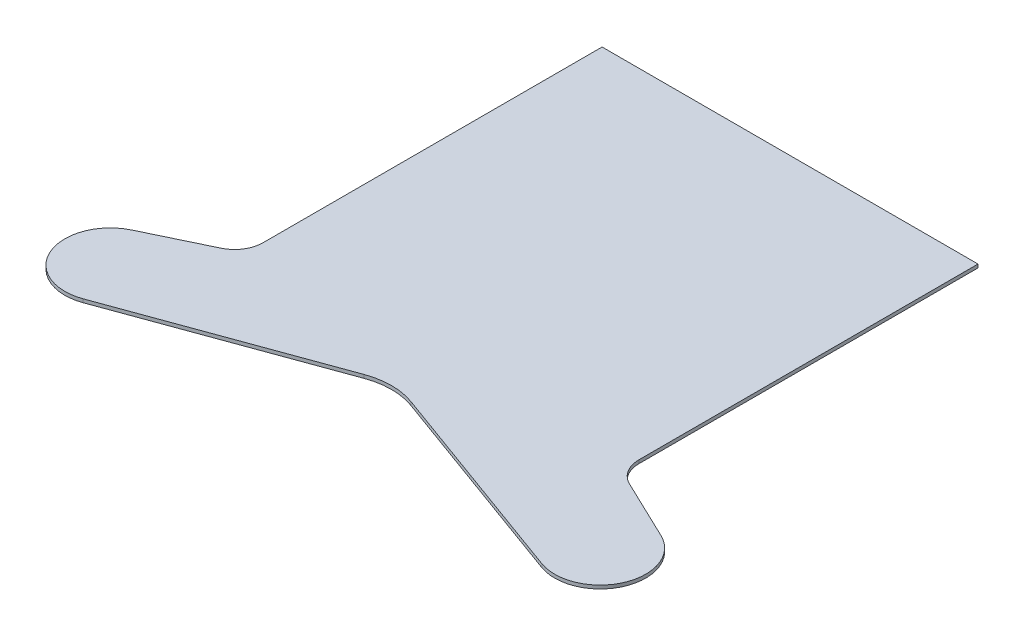
ISO-10303-21;
HEADER;
FILE_DESCRIPTION(('STEP AP214'),'2;1');
FILE_NAME('part.step','',(''),(''),'','','');
FILE_SCHEMA(('AUTOMOTIVE_DESIGN { 1 0 10303 214 1 1 1 1 }'));
ENDSEC;
DATA;
#1=APPLICATION_CONTEXT('core data for automotive mechanical design processes');
#2=APPLICATION_PROTOCOL_DEFINITION('international standard','automotive_design',2000,#1);
#3=PRODUCT_CONTEXT('',#1,'mechanical');
#4=PRODUCT('Part','Part','',(#3));
#5=PRODUCT_RELATED_PRODUCT_CATEGORY('part','',(#4));
#6=PRODUCT_DEFINITION_FORMATION('','',#4);
#7=PRODUCT_DEFINITION_CONTEXT('part definition',#1,'design');
#8=PRODUCT_DEFINITION('design','',#6,#7);
#9=PRODUCT_DEFINITION_SHAPE('','',#8);
#10=(LENGTH_UNIT() NAMED_UNIT(*) SI_UNIT(.MILLI.,.METRE.));
#11=(NAMED_UNIT(*) PLANE_ANGLE_UNIT() SI_UNIT($,.RADIAN.));
#12=(NAMED_UNIT(*) SI_UNIT($,.STERADIAN.) SOLID_ANGLE_UNIT());
#13=UNCERTAINTY_MEASURE_WITH_UNIT(LENGTH_MEASURE(1.E-05),#10,'distance_accuracy_value','');
#14=(GEOMETRIC_REPRESENTATION_CONTEXT(3) GLOBAL_UNCERTAINTY_ASSIGNED_CONTEXT((#13)) GLOBAL_UNIT_ASSIGNED_CONTEXT((#10,
#11,#12)) REPRESENTATION_CONTEXT('',''));
#15=CARTESIAN_POINT('',(0.,0.,0.));
#16=DIRECTION('',(0.,0.,1.));
#17=DIRECTION('',(1.,0.,0.));
#18=AXIS2_PLACEMENT_3D('',#15,#16,#17);
#19=CARTESIAN_POINT('',(24.4316355925699,3.,67.1253671109287));
#20=DIRECTION('',(-0.342020143325673,0.,-0.939692620785907));
#21=DIRECTION('',(-0.939692620785907,0.,0.342020143325673));
#22=AXIS2_PLACEMENT_3D('',#19,#20,#21);
#23=PLANE('',#22);
#24=DIRECTION('',(0.939692620785907,0.,-0.342020143325673));
#25=VECTOR('',#24,1.);
#26=CARTESIAN_POINT('',(24.4316355925699,0.,67.1253671109287));
#27=LINE('',#26,#25);
#28=CARTESIAN_POINT('',(-36.3191942669731,0.,89.2368608867731));
#29=VERTEX_POINT('',#28);
#30=CARTESIAN_POINT('',(144.47879140046,0.,23.4317756885392));
#31=VERTEX_POINT('',#30);
#32=EDGE_CURVE('E210',#29,#31,#27,.T.);
#33=ORIENTED_EDGE('',*,*,#32,.T.);
#34=DIRECTION('',(0.,-1.,0.));
#35=VECTOR('',#34,1.);
#36=CARTESIAN_POINT('',(144.47879140046,3.,23.4317756885392));
#37=LINE('',#36,#35);
#38=CARTESIAN_POINT('',(144.47879140046,3.,23.4317756885392));
#39=VERTEX_POINT('',#38);
#40=EDGE_CURVE('E91',#39,#31,#37,.T.);
#41=ORIENTED_EDGE('',*,*,#40,.F.);
#42=DIRECTION('',(0.939692620785907,0.,-0.342020143325673));
#43=VECTOR('',#42,1.);
#44=CARTESIAN_POINT('',(24.4316355925699,3.,67.1253671109287));
#45=LINE('',#44,#43);
#46=CARTESIAN_POINT('',(-36.3191942669731,3.,89.2368608867731));
#47=VERTEX_POINT('',#46);
#48=EDGE_CURVE('E149',#47,#39,#45,.T.);
#49=ORIENTED_EDGE('',*,*,#48,.F.);
#50=DIRECTION('',(0.,-1.,0.));
#51=VECTOR('',#50,1.);
#52=CARTESIAN_POINT('',(-36.3191942669731,3.,89.2368608867731));
#53=LINE('',#52,#51);
#54=EDGE_CURVE('E12',#47,#29,#53,.T.);
#55=ORIENTED_EDGE('',*,*,#54,.T.);
#56=EDGE_LOOP('',(#33,#41,#49,#55));
#57=FACE_BOUND('',#56,.T.);
#58=ADVANCED_FACE('F81',(#57),#23,.F.);
#59=CARTESIAN_POINT('',(165.,3.,79.8133329356935));
#60=DIRECTION('',(0.,-1.,0.));
#61=DIRECTION('',(0.,0.,-1.));
#62=AXIS2_PLACEMENT_3D('',#59,#60,#61);
#63=CYLINDRICAL_SURFACE('',#62,60.);
#64=CARTESIAN_POINT('',(165.,0.,79.8133329356935));
#65=DIRECTION('',(0.,1.,0.));
#66=DIRECTION('',(0.,0.,1.));
#67=AXIS2_PLACEMENT_3D('',#64,#65,#66);
#68=CIRCLE('',#67,60.);
#69=CARTESIAN_POINT('',(185.52120859954,0.,23.4317756885392));
#70=VERTEX_POINT('',#69);
#71=EDGE_CURVE('E214',#70,#31,#68,.T.);
#72=ORIENTED_EDGE('',*,*,#71,.F.);
#73=DIRECTION('',(0.,-1.,0.));
#74=VECTOR('',#73,1.);
#75=CARTESIAN_POINT('',(185.52120859954,3.,23.4317756885392));
#76=LINE('',#75,#74);
#77=CARTESIAN_POINT('',(185.52120859954,3.,23.4317756885392));
#78=VERTEX_POINT('',#77);
#79=EDGE_CURVE('E273',#78,#70,#76,.T.);
#80=ORIENTED_EDGE('',*,*,#79,.F.);
#81=CARTESIAN_POINT('',(165.,3.,79.8133329356935));
#82=DIRECTION('',(0.,1.,0.));
#83=DIRECTION('',(0.,0.,1.));
#84=AXIS2_PLACEMENT_3D('',#81,#82,#83);
#85=CIRCLE('',#84,60.);
#86=EDGE_CURVE('E281',#78,#39,#85,.T.);
#87=ORIENTED_EDGE('',*,*,#86,.T.);
#88=ORIENTED_EDGE('',*,*,#40,.T.);
#89=EDGE_LOOP('',(#72,#80,#87,#88));
#90=FACE_BOUND('',#89,.T.);
#91=ADVANCED_FACE('F279',(#90),#63,.F.);
#92=CARTESIAN_POINT('',(14.1710312927996,3.,-38.9345884873514));
#93=DIRECTION('',(0.342020143325673,0.,-0.939692620785907));
#94=DIRECTION('',(-0.939692620785907,0.,-0.342020143325673));
#95=AXIS2_PLACEMENT_3D('',#92,#93,#94);
#96=PLANE('',#95);
#97=DIRECTION('',(0.939692620785907,0.,0.342020143325673));
#98=VECTOR('',#97,1.);
#99=CARTESIAN_POINT('',(14.1710312927996,0.,-38.9345884873514));
#100=LINE('',#99,#98);
#101=CARTESIAN_POINT('',(366.319194266973,0.,89.2368608867731));
#102=VERTEX_POINT('',#101);
#103=EDGE_CURVE('E218',#70,#102,#100,.T.);
#104=ORIENTED_EDGE('',*,*,#103,.T.);
#105=DIRECTION('',(0.,-1.,0.));
#106=VECTOR('',#105,1.);
#107=CARTESIAN_POINT('',(366.319194266973,3.,89.2368608867731));
#108=LINE('',#107,#106);
#109=CARTESIAN_POINT('',(366.319194266973,3.,89.2368608867731));
#110=VERTEX_POINT('',#109);
#111=EDGE_CURVE('E270',#110,#102,#108,.T.);
#112=ORIENTED_EDGE('',*,*,#111,.F.);
#113=DIRECTION('',(0.939692620785907,0.,0.342020143325673));
#114=VECTOR('',#113,1.);
#115=CARTESIAN_POINT('',(14.1710312927996,3.,-38.9345884873514));
#116=LINE('',#115,#114);
#117=EDGE_CURVE('E293',#78,#110,#116,.T.);
#118=ORIENTED_EDGE('',*,*,#117,.F.);
#119=ORIENTED_EDGE('',*,*,#79,.T.);
#120=EDGE_LOOP('',(#104,#112,#118,#119));
#121=FACE_BOUND('',#120,.T.);
#122=ADVANCED_FACE('F290',(#121),#96,.F.);
#123=CARTESIAN_POINT('',(380.,3.,51.6491560553368));
#124=DIRECTION('',(0.,-1.,0.));
#125=DIRECTION('',(0.,0.,-1.));
#126=AXIS2_PLACEMENT_3D('',#123,#124,#125);
#127=CYLINDRICAL_SURFACE('',#126,40.);
#128=CARTESIAN_POINT('',(380.,0.,51.6491560553368));
#129=DIRECTION('',(0.,1.,0.));
#130=DIRECTION('',(0.,0.,1.));
#131=AXIS2_PLACEMENT_3D('',#128,#129,#130);
#132=CIRCLE('',#131,40.);
#133=CARTESIAN_POINT('',(397.269835876146,0.,15.5693449581183));
#134=VERTEX_POINT('',#133);
#135=EDGE_CURVE('E222',#134,#102,#132,.F.);
#136=ORIENTED_EDGE('',*,*,#135,.F.);
#137=DIRECTION('',(0.,-1.,0.));
#138=VECTOR('',#137,1.);
#139=CARTESIAN_POINT('',(397.269835876146,3.,15.5693449581183));
#140=LINE('',#139,#138);
#141=CARTESIAN_POINT('',(397.269835876146,3.,15.5693449581183));
#142=VERTEX_POINT('',#141);
#143=EDGE_CURVE('E267',#142,#134,#140,.T.);
#144=ORIENTED_EDGE('',*,*,#143,.F.);
#145=CARTESIAN_POINT('',(380.,3.,51.6491560553368));
#146=DIRECTION('',(0.,1.,0.));
#147=DIRECTION('',(0.,0.,1.));
#148=AXIS2_PLACEMENT_3D('',#145,#146,#147);
#149=CIRCLE('',#148,40.);
#150=EDGE_CURVE('E296',#142,#110,#149,.F.);
#151=ORIENTED_EDGE('',*,*,#150,.T.);
#152=ORIENTED_EDGE('',*,*,#111,.T.);
#153=EDGE_LOOP('',(#136,#144,#151,#152));
#154=FACE_BOUND('',#153,.T.);
#155=ADVANCED_FACE('F337',(#154),#127,.T.);
#156=CARTESIAN_POINT('',(67.989679886292,3.,-142.042739980293));
#157=DIRECTION('',(-0.431745896903656,0.,0.901995277430463));
#158=DIRECTION('',(0.901995277430463,0.,0.431745896903657));
#159=AXIS2_PLACEMENT_3D('',#156,#157,#158);
#160=PLANE('',#159);
#161=DIRECTION('',(-0.901995277430463,0.,-0.431745896903657));
#162=VECTOR('',#161,1.);
#163=CARTESIAN_POINT('',(67.989679886292,0.,-142.042739980293));
#164=LINE('',#163,#162);
#165=CARTESIAN_POINT('',(344.206352577409,0.,-9.82983590556627));
#166=VERTEX_POINT('',#165);
#167=EDGE_CURVE('E226',#134,#166,#164,.T.);
#168=ORIENTED_EDGE('',*,*,#167,.T.);
#169=DIRECTION('',(0.,-1.,0.));
#170=VECTOR('',#169,1.);
#171=CARTESIAN_POINT('',(344.206352577409,3.,-9.82983590556627));
#172=LINE('',#171,#170);
#173=CARTESIAN_POINT('',(344.206352577409,3.,-9.82983590556627));
#174=VERTEX_POINT('',#173);
#175=EDGE_CURVE('E263',#174,#166,#172,.T.);
#176=ORIENTED_EDGE('',*,*,#175,.F.);
#177=DIRECTION('',(-0.901995277430463,0.,-0.431745896903657));
#178=VECTOR('',#177,1.);
#179=CARTESIAN_POINT('',(67.989679886292,3.,-142.042739980293));
#180=LINE('',#179,#178);
#181=EDGE_CURVE('E306',#142,#174,#180,.T.);
#182=ORIENTED_EDGE('',*,*,#181,.F.);
#183=ORIENTED_EDGE('',*,*,#143,.T.);
#184=EDGE_LOOP('',(#168,#176,#182,#183));
#185=FACE_BOUND('',#184,.T.);
#186=ADVANCED_FACE('F340',(#185),#160,.F.);
#187=CARTESIAN_POINT('',(355.,3.,-32.3797178413279));
#188=DIRECTION('',(0.,-1.,0.));
#189=DIRECTION('',(0.,0.,-1.));
#190=AXIS2_PLACEMENT_3D('',#187,#188,#189);
#191=CYLINDRICAL_SURFACE('',#190,25.);
#192=CARTESIAN_POINT('',(355.,0.,-32.3797178413279));
#193=DIRECTION('',(0.,1.,0.));
#194=DIRECTION('',(0.,0.,1.));
#195=AXIS2_PLACEMENT_3D('',#192,#193,#194);
#196=CIRCLE('',#195,25.);
#197=CARTESIAN_POINT('',(330.,0.,-32.3797178413279));
#198=VERTEX_POINT('',#197);
#199=EDGE_CURVE('E229',#166,#198,#196,.F.);
#200=ORIENTED_EDGE('',*,*,#199,.T.);
#201=DIRECTION('',(0.,-1.,0.));
#202=VECTOR('',#201,1.);
#203=CARTESIAN_POINT('',(330.,3.,-32.3797178413279));
#204=LINE('',#203,#202);
#205=CARTESIAN_POINT('',(330.,3.,-32.3797178413279));
#206=VERTEX_POINT('',#205);
#207=EDGE_CURVE('E259',#206,#198,#204,.T.);
#208=ORIENTED_EDGE('',*,*,#207,.F.);
#209=CARTESIAN_POINT('',(355.,3.,-32.3797178413279));
#210=DIRECTION('',(0.,1.,0.));
#211=DIRECTION('',(0.,0.,1.));
#212=AXIS2_PLACEMENT_3D('',#209,#210,#211);
#213=CIRCLE('',#212,25.);
#214=EDGE_CURVE('E309',#174,#206,#213,.F.);
#215=ORIENTED_EDGE('',*,*,#214,.F.);
#216=ORIENTED_EDGE('',*,*,#175,.T.);
#217=EDGE_LOOP('',(#200,#208,#215,#216));
#218=FACE_BOUND('',#217,.T.);
#219=ADVANCED_FACE('F344',(#218),#191,.F.);
#220=CARTESIAN_POINT('',(330.,3.,-1.11022302462516E-13));
#221=DIRECTION('',(-1.,0.,0.));
#222=DIRECTION('',(0.,0.,1.));
#223=AXIS2_PLACEMENT_3D('',#220,#221,#222);
#224=PLANE('',#223);
#225=DIRECTION('',(0.,0.,-1.));
#226=VECTOR('',#225,1.);
#227=CARTESIAN_POINT('',(330.,0.,-1.11022302462516E-13));
#228=LINE('',#227,#226);
#229=CARTESIAN_POINT('',(330.,0.,-330.));
#230=VERTEX_POINT('',#229);
#231=EDGE_CURVE('E232',#198,#230,#228,.T.);
#232=ORIENTED_EDGE('',*,*,#231,.T.);
#233=DIRECTION('',(0.,-1.,0.));
#234=VECTOR('',#233,1.);
#235=CARTESIAN_POINT('',(330.,3.,-330.));
#236=LINE('',#235,#234);
#237=CARTESIAN_POINT('',(330.,3.,-330.));
#238=VERTEX_POINT('',#237);
#239=EDGE_CURVE('E256',#238,#230,#236,.T.);
#240=ORIENTED_EDGE('',*,*,#239,.F.);
#241=DIRECTION('',(0.,0.,-1.));
#242=VECTOR('',#241,1.);
#243=CARTESIAN_POINT('',(330.,3.,-1.11022302462516E-13));
#244=LINE('',#243,#242);
#245=EDGE_CURVE('E312',#206,#238,#244,.T.);
#246=ORIENTED_EDGE('',*,*,#245,.F.);
#247=ORIENTED_EDGE('',*,*,#207,.T.);
#248=EDGE_LOOP('',(#232,#240,#246,#247));
#249=FACE_BOUND('',#248,.T.);
#250=ADVANCED_FACE('F348',(#249),#224,.F.);
#251=CARTESIAN_POINT('',(0.,3.,-330.));
#252=DIRECTION('',(0.,0.,-1.));
#253=DIRECTION('',(-1.,0.,0.));
#254=AXIS2_PLACEMENT_3D('',#251,#252,#253);
#255=PLANE('',#254);
#256=DIRECTION('',(1.,0.,0.));
#257=VECTOR('',#256,1.);
#258=CARTESIAN_POINT('',(0.,0.,-330.));
#259=LINE('',#258,#257);
#260=CARTESIAN_POINT('',(0.,0.,-330.));
#261=VERTEX_POINT('',#260);
#262=EDGE_CURVE('E236',#261,#230,#259,.T.);
#263=ORIENTED_EDGE('',*,*,#262,.F.);
#264=DIRECTION('',(0.,-1.,0.));
#265=VECTOR('',#264,1.);
#266=CARTESIAN_POINT('',(0.,3.,-330.));
#267=LINE('',#266,#265);
#268=CARTESIAN_POINT('',(0.,3.,-330.));
#269=VERTEX_POINT('',#268);
#270=EDGE_CURVE('E187',#269,#261,#267,.T.);
#271=ORIENTED_EDGE('',*,*,#270,.F.);
#272=DIRECTION('',(1.,0.,0.));
#273=VECTOR('',#272,1.);
#274=CARTESIAN_POINT('',(0.,3.,-330.));
#275=LINE('',#274,#273);
#276=EDGE_CURVE('E196',#269,#238,#275,.T.);
#277=ORIENTED_EDGE('',*,*,#276,.T.);
#278=ORIENTED_EDGE('',*,*,#239,.T.);
#279=EDGE_LOOP('',(#263,#271,#277,#278));
#280=FACE_BOUND('',#279,.T.);
#281=ADVANCED_FACE('F317',(#280),#255,.T.);
#282=CARTESIAN_POINT('',(0.,3.,0.));
#283=DIRECTION('',(-1.,0.,0.));
#284=DIRECTION('',(0.,0.,1.));
#285=AXIS2_PLACEMENT_3D('',#282,#283,#284);
#286=PLANE('',#285);
#287=DIRECTION('',(0.,0.,-1.));
#288=VECTOR('',#287,1.);
#289=CARTESIAN_POINT('',(0.,0.,0.));
#290=LINE('',#289,#288);
#291=CARTESIAN_POINT('',(0.,0.,-32.3797178413278));
#292=VERTEX_POINT('',#291);
#293=EDGE_CURVE('E182',#292,#261,#290,.T.);
#294=ORIENTED_EDGE('',*,*,#293,.F.);
#295=DIRECTION('',(0.,-1.,0.));
#296=VECTOR('',#295,1.);
#297=CARTESIAN_POINT('',(0.,3.,-32.3797178413278));
#298=LINE('',#297,#296);
#299=CARTESIAN_POINT('',(0.,3.,-32.3797178413278));
#300=VERTEX_POINT('',#299);
#301=EDGE_CURVE('E177',#300,#292,#298,.T.);
#302=ORIENTED_EDGE('',*,*,#301,.F.);
#303=DIRECTION('',(0.,0.,-1.));
#304=VECTOR('',#303,1.);
#305=CARTESIAN_POINT('',(0.,3.,0.));
#306=LINE('',#305,#304);
#307=EDGE_CURVE('E180',#300,#269,#306,.T.);
#308=ORIENTED_EDGE('',*,*,#307,.T.);
#309=ORIENTED_EDGE('',*,*,#270,.T.);
#310=EDGE_LOOP('',(#294,#302,#308,#309));
#311=FACE_BOUND('',#310,.T.);
#312=ADVANCED_FACE('F179',(#311),#286,.T.);
#313=CARTESIAN_POINT('',(-25.,3.,-32.3797178413278));
#314=DIRECTION('',(0.,-1.,0.));
#315=DIRECTION('',(0.,0.,-1.));
#316=AXIS2_PLACEMENT_3D('',#313,#314,#315);
#317=CYLINDRICAL_SURFACE('',#316,25.);
#318=CARTESIAN_POINT('',(-25.,0.,-32.3797178413278));
#319=DIRECTION('',(0.,1.,0.));
#320=DIRECTION('',(0.,0.,1.));
#321=AXIS2_PLACEMENT_3D('',#318,#319,#320);
#322=CIRCLE('',#321,25.);
#323=CARTESIAN_POINT('',(-14.2063525774086,0.,-9.82983590556627));
#324=VERTEX_POINT('',#323);
#325=EDGE_CURVE('E242',#324,#292,#322,.T.);
#326=ORIENTED_EDGE('',*,*,#325,.F.);
#327=DIRECTION('',(0.,-1.,0.));
#328=VECTOR('',#327,1.);
#329=CARTESIAN_POINT('',(-14.2063525774086,3.,-9.82983590556627));
#330=LINE('',#329,#328);
#331=CARTESIAN_POINT('',(-14.2063525774086,3.,-9.82983590556627));
#332=VERTEX_POINT('',#331);
#333=EDGE_CURVE('E137',#332,#324,#330,.T.);
#334=ORIENTED_EDGE('',*,*,#333,.F.);
#335=CARTESIAN_POINT('',(-25.,3.,-32.3797178413278));
#336=DIRECTION('',(0.,1.,0.));
#337=DIRECTION('',(0.,0.,1.));
#338=AXIS2_PLACEMENT_3D('',#335,#336,#337);
#339=CIRCLE('',#338,25.);
#340=EDGE_CURVE('E194',#332,#300,#339,.T.);
#341=ORIENTED_EDGE('',*,*,#340,.T.);
#342=ORIENTED_EDGE('',*,*,#301,.T.);
#343=EDGE_LOOP('',(#326,#334,#341,#342));
#344=FACE_BOUND('',#343,.T.);
#345=ADVANCED_FACE('F199',(#344),#317,.F.);
#346=CARTESIAN_POINT('',(-6.47618845355486,3.,-13.529929161457));
#347=DIRECTION('',(-0.431745896903657,0.,-0.901995277430462));
#348=DIRECTION('',(-0.901995277430462,0.,0.431745896903657));
#349=AXIS2_PLACEMENT_3D('',#346,#347,#348);
#350=PLANE('',#349);
#351=DIRECTION('',(0.901995277430462,0.,-0.431745896903657));
#352=VECTOR('',#351,1.);
#353=CARTESIAN_POINT('',(-6.47618845355486,0.,-13.529929161457));
#354=LINE('',#353,#352);
#355=CARTESIAN_POINT('',(-67.2698358761463,0.,15.5693449581184));
#356=VERTEX_POINT('',#355);
#357=EDGE_CURVE('E245',#356,#324,#354,.T.);
#358=ORIENTED_EDGE('',*,*,#357,.F.);
#359=DIRECTION('',(0.,-1.,0.));
#360=VECTOR('',#359,1.);
#361=CARTESIAN_POINT('',(-67.2698358761463,3.,15.5693449581184));
#362=LINE('',#361,#360);
#363=CARTESIAN_POINT('',(-67.2698358761463,3.,15.5693449581184));
#364=VERTEX_POINT('',#363);
#365=EDGE_CURVE('E99',#364,#356,#362,.T.);
#366=ORIENTED_EDGE('',*,*,#365,.F.);
#367=DIRECTION('',(0.901995277430462,0.,-0.431745896903657));
#368=VECTOR('',#367,1.);
#369=CARTESIAN_POINT('',(-6.47618845355486,3.,-13.529929161457));
#370=LINE('',#369,#368);
#371=EDGE_CURVE('E201',#364,#332,#370,.T.);
#372=ORIENTED_EDGE('',*,*,#371,.T.);
#373=ORIENTED_EDGE('',*,*,#333,.T.);
#374=EDGE_LOOP('',(#358,#366,#372,#373));
#375=FACE_BOUND('',#374,.T.);
#376=ADVANCED_FACE('F320',(#375),#350,.T.);
#377=CARTESIAN_POINT('',(-50.,3.,51.6491560553369));
#378=DIRECTION('',(0.,-1.,0.));
#379=DIRECTION('',(0.,0.,-1.));
#380=AXIS2_PLACEMENT_3D('',#377,#378,#379);
#381=CYLINDRICAL_SURFACE('',#380,40.);
#382=CARTESIAN_POINT('',(-50.,0.,51.6491560553369));
#383=DIRECTION('',(0.,1.,0.));
#384=DIRECTION('',(0.,0.,1.));
#385=AXIS2_PLACEMENT_3D('',#382,#383,#384);
#386=CIRCLE('',#385,40.);
#387=EDGE_CURVE('E207',#356,#29,#386,.T.);
#388=ORIENTED_EDGE('',*,*,#387,.T.);
#389=ORIENTED_EDGE('',*,*,#54,.F.);
#390=CARTESIAN_POINT('',(-50.,3.,51.6491560553369));
#391=DIRECTION('',(0.,1.,0.));
#392=DIRECTION('',(0.,0.,1.));
#393=AXIS2_PLACEMENT_3D('',#390,#391,#392);
#394=CIRCLE('',#393,40.);
#395=EDGE_CURVE('E249',#364,#47,#394,.T.);
#396=ORIENTED_EDGE('',*,*,#395,.F.);
#397=ORIENTED_EDGE('',*,*,#365,.T.);
#398=EDGE_LOOP('',(#388,#389,#396,#397));
#399=FACE_BOUND('',#398,.T.);
#400=ADVANCED_FACE('F83',(#399),#381,.T.);
#401=CARTESIAN_POINT('',(0.,0.,0.));
#402=DIRECTION('',(0.,1.,0.));
#403=DIRECTION('',(0.,0.,1.));
#404=AXIS2_PLACEMENT_3D('',#401,#402,#403);
#405=PLANE('',#404);
#406=ORIENTED_EDGE('',*,*,#387,.F.);
#407=ORIENTED_EDGE('',*,*,#357,.T.);
#408=ORIENTED_EDGE('',*,*,#325,.T.);
#409=ORIENTED_EDGE('',*,*,#293,.T.);
#410=ORIENTED_EDGE('',*,*,#262,.T.);
#411=ORIENTED_EDGE('',*,*,#231,.F.);
#412=ORIENTED_EDGE('',*,*,#199,.F.);
#413=ORIENTED_EDGE('',*,*,#167,.F.);
#414=ORIENTED_EDGE('',*,*,#135,.T.);
#415=ORIENTED_EDGE('',*,*,#103,.F.);
#416=ORIENTED_EDGE('',*,*,#71,.T.);
#417=ORIENTED_EDGE('',*,*,#32,.F.);
#418=EDGE_LOOP('',(#406,#407,#408,#409,#410,#411,#412,#413,#414,#415,#416,#417));
#419=FACE_BOUND('',#418,.T.);
#420=ADVANCED_FACE('F285',(#419),#405,.F.);
#421=CARTESIAN_POINT('',(0.,3.,0.));
#422=DIRECTION('',(0.,1.,0.));
#423=DIRECTION('',(0.,0.,1.));
#424=AXIS2_PLACEMENT_3D('',#421,#422,#423);
#425=PLANE('',#424);
#426=ORIENTED_EDGE('',*,*,#395,.T.);
#427=ORIENTED_EDGE('',*,*,#48,.T.);
#428=ORIENTED_EDGE('',*,*,#86,.F.);
#429=ORIENTED_EDGE('',*,*,#117,.T.);
#430=ORIENTED_EDGE('',*,*,#150,.F.);
#431=ORIENTED_EDGE('',*,*,#181,.T.);
#432=ORIENTED_EDGE('',*,*,#214,.T.);
#433=ORIENTED_EDGE('',*,*,#245,.T.);
#434=ORIENTED_EDGE('',*,*,#276,.F.);
#435=ORIENTED_EDGE('',*,*,#307,.F.);
#436=ORIENTED_EDGE('',*,*,#340,.F.);
#437=ORIENTED_EDGE('',*,*,#371,.F.);
#438=EDGE_LOOP('',(#426,#427,#428,#429,#430,#431,#432,#433,#434,#435,#436,#437));
#439=FACE_BOUND('',#438,.T.);
#440=ADVANCED_FACE('F192',(#439),#425,.T.);
#441=CLOSED_SHELL('',(#58,#91,#122,#155,#186,#219,#250,#281,#312,#345,#376,#400,#420,#440));
#442=MANIFOLD_SOLID_BREP('B2',#441);
#443=ADVANCED_BREP_SHAPE_REPRESENTATION('',(#18,#442),#14);
#444=SHAPE_DEFINITION_REPRESENTATION(#9,#443);
ENDSEC;
END-ISO-10303-21;
